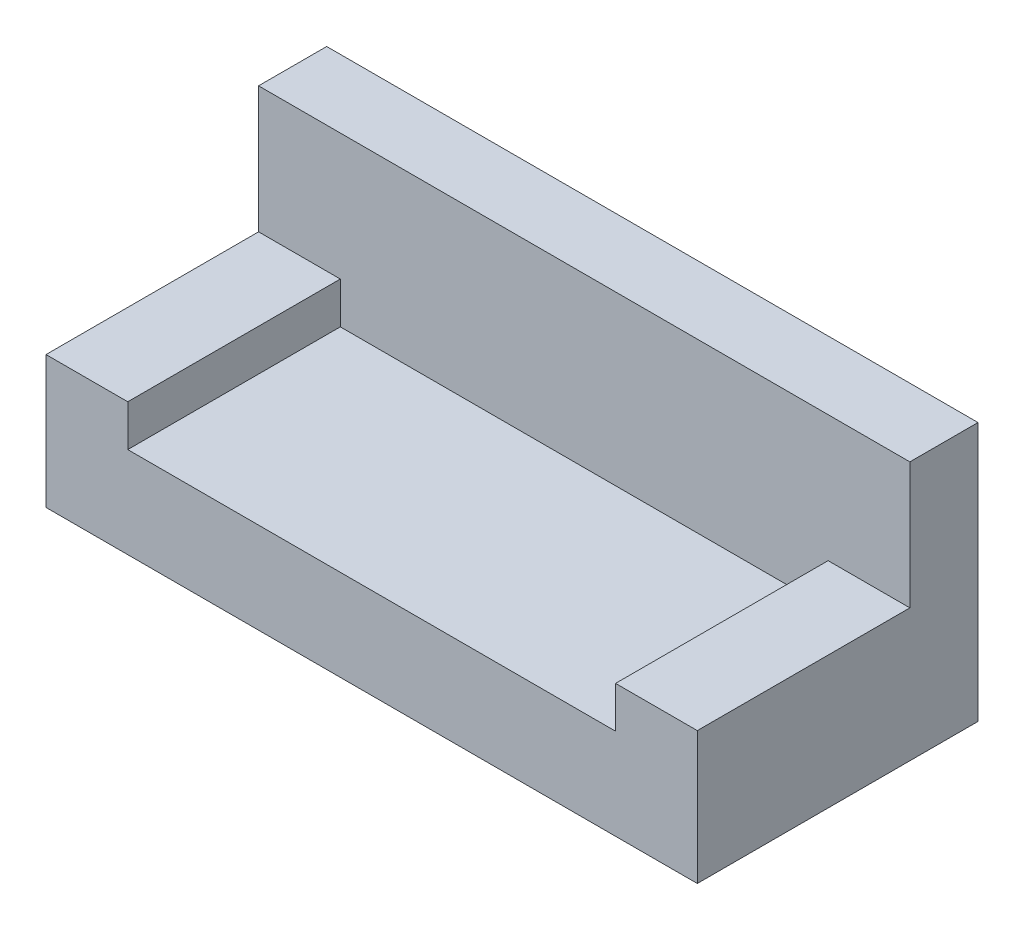
ISO-10303-21;
HEADER;
FILE_DESCRIPTION(('STEP AP214'),'2;1');
FILE_NAME('part.step','',(''),(''),'','','');
FILE_SCHEMA(('AUTOMOTIVE_DESIGN { 1 0 10303 214 1 1 1 1 }'));
ENDSEC;
DATA;
#1=APPLICATION_CONTEXT('core data for automotive mechanical design processes');
#2=APPLICATION_PROTOCOL_DEFINITION('international standard','automotive_design',2000,#1);
#3=PRODUCT_CONTEXT('',#1,'mechanical');
#4=PRODUCT('Part','Part','',(#3));
#5=PRODUCT_RELATED_PRODUCT_CATEGORY('part','',(#4));
#6=PRODUCT_DEFINITION_FORMATION('','',#4);
#7=PRODUCT_DEFINITION_CONTEXT('part definition',#1,'design');
#8=PRODUCT_DEFINITION('design','',#6,#7);
#9=PRODUCT_DEFINITION_SHAPE('','',#8);
#10=(LENGTH_UNIT() NAMED_UNIT(*) SI_UNIT(.MILLI.,.METRE.));
#11=(NAMED_UNIT(*) PLANE_ANGLE_UNIT() SI_UNIT($,.RADIAN.));
#12=(NAMED_UNIT(*) SI_UNIT($,.STERADIAN.) SOLID_ANGLE_UNIT());
#13=UNCERTAINTY_MEASURE_WITH_UNIT(LENGTH_MEASURE(1.E-05),#10,'distance_accuracy_value','');
#14=(GEOMETRIC_REPRESENTATION_CONTEXT(3) GLOBAL_UNCERTAINTY_ASSIGNED_CONTEXT((#13)) GLOBAL_UNIT_ASSIGNED_CONTEXT((#10,
#11,#12)) REPRESENTATION_CONTEXT('',''));
#15=CARTESIAN_POINT('',(0.,0.,0.));
#16=DIRECTION('',(0.,0.,1.));
#17=DIRECTION('',(1.,0.,0.));
#18=AXIS2_PLACEMENT_3D('',#15,#16,#17);
#19=CARTESIAN_POINT('',(0.,950.,0.));
#20=DIRECTION('',(0.,0.,-1.));
#21=DIRECTION('',(-1.,0.,0.));
#22=AXIS2_PLACEMENT_3D('',#19,#20,#21);
#23=PLANE('',#22);
#24=DIRECTION('',(0.,1.,0.));
#25=VECTOR('',#24,1.);
#26=CARTESIAN_POINT('',(300.,334.,0.));
#27=LINE('',#26,#25);
#28=CARTESIAN_POINT('',(300.,334.,0.));
#29=VERTEX_POINT('',#28);
#30=CARTESIAN_POINT('',(300.,486.,0.));
#31=VERTEX_POINT('',#30);
#32=EDGE_CURVE('E126',#29,#31,#27,.T.);
#33=ORIENTED_EDGE('',*,*,#32,.T.);
#34=DIRECTION('',(1.,0.,0.));
#35=VECTOR('',#34,1.);
#36=CARTESIAN_POINT('',(0.,486.,0.));
#37=LINE('',#36,#35);
#38=CARTESIAN_POINT('',(0.,486.,0.));
#39=VERTEX_POINT('',#38);
#40=EDGE_CURVE('E114',#39,#31,#37,.T.);
#41=ORIENTED_EDGE('',*,*,#40,.F.);
#42=DIRECTION('',(0.,-1.,0.));
#43=VECTOR('',#42,1.);
#44=CARTESIAN_POINT('',(0.,950.,0.));
#45=LINE('',#44,#43);
#46=CARTESIAN_POINT('',(0.,0.,0.));
#47=VERTEX_POINT('',#46);
#48=EDGE_CURVE('E11',#39,#47,#45,.T.);
#49=ORIENTED_EDGE('',*,*,#48,.T.);
#50=DIRECTION('',(1.,0.,0.));
#51=VECTOR('',#50,1.);
#52=CARTESIAN_POINT('',(0.,0.,0.));
#53=LINE('',#52,#51);
#54=CARTESIAN_POINT('',(2390.,0.,0.));
#55=VERTEX_POINT('',#54);
#56=EDGE_CURVE('E138',#47,#55,#53,.T.);
#57=ORIENTED_EDGE('',*,*,#56,.T.);
#58=DIRECTION('',(0.,-1.,0.));
#59=VECTOR('',#58,1.);
#60=CARTESIAN_POINT('',(2390.,950.,0.));
#61=LINE('',#60,#59);
#62=CARTESIAN_POINT('',(2390.,486.,0.));
#63=VERTEX_POINT('',#62);
#64=EDGE_CURVE('E44',#63,#55,#61,.T.);
#65=ORIENTED_EDGE('',*,*,#64,.F.);
#66=DIRECTION('',(1.,0.,0.));
#67=VECTOR('',#66,1.);
#68=CARTESIAN_POINT('',(2390.,486.,0.));
#69=LINE('',#68,#67);
#70=CARTESIAN_POINT('',(2090.,486.,0.));
#71=VERTEX_POINT('',#70);
#72=EDGE_CURVE('E199',#71,#63,#69,.T.);
#73=ORIENTED_EDGE('',*,*,#72,.F.);
#74=DIRECTION('',(0.,1.,0.));
#75=VECTOR('',#74,1.);
#76=CARTESIAN_POINT('',(2090.,334.,0.));
#77=LINE('',#76,#75);
#78=CARTESIAN_POINT('',(2090.,334.,0.));
#79=VERTEX_POINT('',#78);
#80=EDGE_CURVE('E178',#79,#71,#77,.T.);
#81=ORIENTED_EDGE('',*,*,#80,.F.);
#82=DIRECTION('',(1.,0.,0.));
#83=VECTOR('',#82,1.);
#84=CARTESIAN_POINT('',(300.,334.,0.));
#85=LINE('',#84,#83);
#86=EDGE_CURVE('E193',#29,#79,#85,.T.);
#87=ORIENTED_EDGE('',*,*,#86,.F.);
#88=EDGE_LOOP('',(#33,#41,#49,#57,#65,#73,#81,#87));
#89=FACE_BOUND('',#88,.T.);
#90=ADVANCED_FACE('F36',(#89),#23,.F.);
#91=CARTESIAN_POINT('',(2090.,334.,0.));
#92=DIRECTION('',(1.,0.,0.));
#93=DIRECTION('',(0.,0.,-1.));
#94=AXIS2_PLACEMENT_3D('',#91,#92,#93);
#95=PLANE('',#94);
#96=DIRECTION('',(0.,0.,1.));
#97=VECTOR('',#96,1.);
#98=CARTESIAN_POINT('',(2090.,486.,0.));
#99=LINE('',#98,#97);
#100=CARTESIAN_POINT('',(2090.,486.,-780.));
#101=VERTEX_POINT('',#100);
#102=EDGE_CURVE('E201',#101,#71,#99,.T.);
#103=ORIENTED_EDGE('',*,*,#102,.F.);
#104=DIRECTION('',(0.,1.,0.));
#105=VECTOR('',#104,1.);
#106=CARTESIAN_POINT('',(2090.,334.,-780.));
#107=LINE('',#106,#105);
#108=CARTESIAN_POINT('',(2090.,334.,-780.));
#109=VERTEX_POINT('',#108);
#110=EDGE_CURVE('E144',#109,#101,#107,.T.);
#111=ORIENTED_EDGE('',*,*,#110,.F.);
#112=DIRECTION('',(0.,0.,-1.));
#113=VECTOR('',#112,1.);
#114=CARTESIAN_POINT('',(2090.,334.,0.));
#115=LINE('',#114,#113);
#116=EDGE_CURVE('E190',#79,#109,#115,.T.);
#117=ORIENTED_EDGE('',*,*,#116,.F.);
#118=ORIENTED_EDGE('',*,*,#80,.T.);
#119=EDGE_LOOP('',(#103,#111,#117,#118));
#120=FACE_BOUND('',#119,.T.);
#121=ADVANCED_FACE('F216',(#120),#95,.F.);
#122=CARTESIAN_POINT('',(0.,950.,0.));
#123=DIRECTION('',(1.,0.,0.));
#124=DIRECTION('',(0.,0.,-1.));
#125=AXIS2_PLACEMENT_3D('',#122,#123,#124);
#126=PLANE('',#125);
#127=DIRECTION('',(0.,0.,1.));
#128=VECTOR('',#127,1.);
#129=CARTESIAN_POINT('',(0.,486.,0.));
#130=LINE('',#129,#128);
#131=CARTESIAN_POINT('',(0.,486.,-780.));
#132=VERTEX_POINT('',#131);
#133=EDGE_CURVE('E111',#132,#39,#130,.T.);
#134=ORIENTED_EDGE('',*,*,#133,.F.);
#135=DIRECTION('',(0.,1.,0.));
#136=VECTOR('',#135,1.);
#137=CARTESIAN_POINT('',(0.,486.,-780.));
#138=LINE('',#137,#136);
#139=CARTESIAN_POINT('',(0.,950.,-780.));
#140=VERTEX_POINT('',#139);
#141=EDGE_CURVE('E187',#132,#140,#138,.T.);
#142=ORIENTED_EDGE('',*,*,#141,.T.);
#143=DIRECTION('',(0.,0.,1.));
#144=VECTOR('',#143,1.);
#145=CARTESIAN_POINT('',(0.,950.,0.));
#146=LINE('',#145,#144);
#147=CARTESIAN_POINT('',(0.,950.,-1030.));
#148=VERTEX_POINT('',#147);
#149=EDGE_CURVE('E153',#148,#140,#146,.T.);
#150=ORIENTED_EDGE('',*,*,#149,.F.);
#151=DIRECTION('',(0.,-1.,0.));
#152=VECTOR('',#151,1.);
#153=CARTESIAN_POINT('',(0.,950.,-1030.));
#154=LINE('',#153,#152);
#155=CARTESIAN_POINT('',(0.,0.,-1030.));
#156=VERTEX_POINT('',#155);
#157=EDGE_CURVE('E135',#148,#156,#154,.T.);
#158=ORIENTED_EDGE('',*,*,#157,.T.);
#159=DIRECTION('',(0.,0.,1.));
#160=VECTOR('',#159,1.);
#161=CARTESIAN_POINT('',(0.,0.,0.));
#162=LINE('',#161,#160);
#163=EDGE_CURVE('E132',#156,#47,#162,.T.);
#164=ORIENTED_EDGE('',*,*,#163,.T.);
#165=ORIENTED_EDGE('',*,*,#48,.F.);
#166=EDGE_LOOP('',(#134,#142,#150,#158,#164,#165));
#167=FACE_BOUND('',#166,.T.);
#168=ADVANCED_FACE('F38',(#167),#126,.F.);
#169=CARTESIAN_POINT('',(2390.,950.,0.));
#170=DIRECTION('',(-1.,0.,0.));
#171=DIRECTION('',(0.,0.,1.));
#172=AXIS2_PLACEMENT_3D('',#169,#170,#171);
#173=PLANE('',#172);
#174=DIRECTION('',(0.,0.,-1.));
#175=VECTOR('',#174,1.);
#176=CARTESIAN_POINT('',(2390.,950.,0.));
#177=LINE('',#176,#175);
#178=CARTESIAN_POINT('',(2390.,950.,-780.));
#179=VERTEX_POINT('',#178);
#180=CARTESIAN_POINT('',(2390.,950.,-1030.));
#181=VERTEX_POINT('',#180);
#182=EDGE_CURVE('E171',#179,#181,#177,.T.);
#183=ORIENTED_EDGE('',*,*,#182,.F.);
#184=DIRECTION('',(0.,1.,0.));
#185=VECTOR('',#184,1.);
#186=CARTESIAN_POINT('',(2390.,486.,-780.));
#187=LINE('',#186,#185);
#188=CARTESIAN_POINT('',(2390.,486.,-780.));
#189=VERTEX_POINT('',#188);
#190=EDGE_CURVE('E119',#189,#179,#187,.T.);
#191=ORIENTED_EDGE('',*,*,#190,.F.);
#192=DIRECTION('',(0.,0.,-1.));
#193=VECTOR('',#192,1.);
#194=CARTESIAN_POINT('',(2390.,486.,0.));
#195=LINE('',#194,#193);
#196=EDGE_CURVE('E165',#63,#189,#195,.T.);
#197=ORIENTED_EDGE('',*,*,#196,.F.);
#198=ORIENTED_EDGE('',*,*,#64,.T.);
#199=DIRECTION('',(0.,0.,-1.));
#200=VECTOR('',#199,1.);
#201=CARTESIAN_POINT('',(2390.,0.,0.));
#202=LINE('',#201,#200);
#203=CARTESIAN_POINT('',(2390.,0.,-1030.));
#204=VERTEX_POINT('',#203);
#205=EDGE_CURVE('E141',#55,#204,#202,.T.);
#206=ORIENTED_EDGE('',*,*,#205,.T.);
#207=DIRECTION('',(0.,-1.,0.));
#208=VECTOR('',#207,1.);
#209=CARTESIAN_POINT('',(2390.,950.,-1030.));
#210=LINE('',#209,#208);
#211=EDGE_CURVE('E155',#181,#204,#210,.T.);
#212=ORIENTED_EDGE('',*,*,#211,.F.);
#213=EDGE_LOOP('',(#183,#191,#197,#198,#206,#212));
#214=FACE_BOUND('',#213,.T.);
#215=ADVANCED_FACE('F161',(#214),#173,.F.);
#216=CARTESIAN_POINT('',(0.,950.,-1030.));
#217=DIRECTION('',(0.,0.,1.));
#218=DIRECTION('',(1.,0.,0.));
#219=AXIS2_PLACEMENT_3D('',#216,#217,#218);
#220=PLANE('',#219);
#221=DIRECTION('',(-1.,0.,0.));
#222=VECTOR('',#221,1.);
#223=CARTESIAN_POINT('',(0.,0.,-1030.));
#224=LINE('',#223,#222);
#225=EDGE_CURVE('E151',#204,#156,#224,.T.);
#226=ORIENTED_EDGE('',*,*,#225,.T.);
#227=ORIENTED_EDGE('',*,*,#157,.F.);
#228=DIRECTION('',(-1.,0.,0.));
#229=VECTOR('',#228,1.);
#230=CARTESIAN_POINT('',(0.,950.,-1030.));
#231=LINE('',#230,#229);
#232=EDGE_CURVE('E147',#181,#148,#231,.T.);
#233=ORIENTED_EDGE('',*,*,#232,.F.);
#234=ORIENTED_EDGE('',*,*,#211,.T.);
#235=EDGE_LOOP('',(#226,#227,#233,#234));
#236=FACE_BOUND('',#235,.T.);
#237=ADVANCED_FACE('F169',(#236),#220,.F.);
#238=CARTESIAN_POINT('',(0.,950.,0.));
#239=DIRECTION('',(0.,-1.,0.));
#240=DIRECTION('',(0.,0.,-1.));
#241=AXIS2_PLACEMENT_3D('',#238,#239,#240);
#242=PLANE('',#241);
#243=ORIENTED_EDGE('',*,*,#149,.T.);
#244=DIRECTION('',(-1.,0.,0.));
#245=VECTOR('',#244,1.);
#246=CARTESIAN_POINT('',(300.,950.,-780.));
#247=LINE('',#246,#245);
#248=EDGE_CURVE('E184',#179,#140,#247,.T.);
#249=ORIENTED_EDGE('',*,*,#248,.F.);
#250=ORIENTED_EDGE('',*,*,#182,.T.);
#251=ORIENTED_EDGE('',*,*,#232,.T.);
#252=EDGE_LOOP('',(#243,#249,#250,#251));
#253=FACE_BOUND('',#252,.T.);
#254=ADVANCED_FACE('F236',(#253),#242,.F.);
#255=CARTESIAN_POINT('',(0.,0.,0.));
#256=DIRECTION('',(0.,-1.,0.));
#257=DIRECTION('',(0.,0.,-1.));
#258=AXIS2_PLACEMENT_3D('',#255,#256,#257);
#259=PLANE('',#258);
#260=ORIENTED_EDGE('',*,*,#163,.F.);
#261=ORIENTED_EDGE('',*,*,#225,.F.);
#262=ORIENTED_EDGE('',*,*,#205,.F.);
#263=ORIENTED_EDGE('',*,*,#56,.F.);
#264=EDGE_LOOP('',(#260,#261,#262,#263));
#265=FACE_BOUND('',#264,.T.);
#266=ADVANCED_FACE('F167',(#265),#259,.T.);
#267=CARTESIAN_POINT('',(300.,334.,0.));
#268=DIRECTION('',(-1.,0.,0.));
#269=DIRECTION('',(0.,0.,1.));
#270=AXIS2_PLACEMENT_3D('',#267,#268,#269);
#271=PLANE('',#270);
#272=DIRECTION('',(0.,1.,0.));
#273=VECTOR('',#272,1.);
#274=CARTESIAN_POINT('',(300.,334.,-780.));
#275=LINE('',#274,#273);
#276=CARTESIAN_POINT('',(300.,334.,-780.));
#277=VERTEX_POINT('',#276);
#278=CARTESIAN_POINT('',(300.,486.,-780.));
#279=VERTEX_POINT('',#278);
#280=EDGE_CURVE('E139',#277,#279,#275,.T.);
#281=ORIENTED_EDGE('',*,*,#280,.T.);
#282=DIRECTION('',(0.,0.,-1.));
#283=VECTOR('',#282,1.);
#284=CARTESIAN_POINT('',(300.,486.,0.));
#285=LINE('',#284,#283);
#286=EDGE_CURVE('E127',#31,#279,#285,.T.);
#287=ORIENTED_EDGE('',*,*,#286,.F.);
#288=ORIENTED_EDGE('',*,*,#32,.F.);
#289=DIRECTION('',(0.,0.,1.));
#290=VECTOR('',#289,1.);
#291=CARTESIAN_POINT('',(300.,334.,0.));
#292=LINE('',#291,#290);
#293=EDGE_CURVE('E186',#277,#29,#292,.T.);
#294=ORIENTED_EDGE('',*,*,#293,.F.);
#295=EDGE_LOOP('',(#281,#287,#288,#294));
#296=FACE_BOUND('',#295,.T.);
#297=ADVANCED_FACE('F209',(#296),#271,.F.);
#298=CARTESIAN_POINT('',(300.,334.,-780.));
#299=DIRECTION('',(0.,0.,-1.));
#300=DIRECTION('',(-1.,0.,0.));
#301=AXIS2_PLACEMENT_3D('',#298,#299,#300);
#302=PLANE('',#301);
#303=ORIENTED_EDGE('',*,*,#248,.T.);
#304=ORIENTED_EDGE('',*,*,#141,.F.);
#305=DIRECTION('',(-1.,0.,0.));
#306=VECTOR('',#305,1.);
#307=CARTESIAN_POINT('',(0.,486.,-780.));
#308=LINE('',#307,#306);
#309=EDGE_CURVE('E51',#279,#132,#308,.T.);
#310=ORIENTED_EDGE('',*,*,#309,.F.);
#311=ORIENTED_EDGE('',*,*,#280,.F.);
#312=DIRECTION('',(-1.,0.,0.));
#313=VECTOR('',#312,1.);
#314=CARTESIAN_POINT('',(300.,334.,-780.));
#315=LINE('',#314,#313);
#316=EDGE_CURVE('E179',#109,#277,#315,.T.);
#317=ORIENTED_EDGE('',*,*,#316,.F.);
#318=ORIENTED_EDGE('',*,*,#110,.T.);
#319=DIRECTION('',(-1.,0.,0.));
#320=VECTOR('',#319,1.);
#321=CARTESIAN_POINT('',(2390.,486.,-780.));
#322=LINE('',#321,#320);
#323=EDGE_CURVE('E59',#189,#101,#322,.T.);
#324=ORIENTED_EDGE('',*,*,#323,.F.);
#325=ORIENTED_EDGE('',*,*,#190,.T.);
#326=EDGE_LOOP('',(#303,#304,#310,#311,#317,#318,#324,#325));
#327=FACE_BOUND('',#326,.T.);
#328=ADVANCED_FACE('F211',(#327),#302,.F.);
#329=CARTESIAN_POINT('',(0.,334.,0.));
#330=DIRECTION('',(0.,-1.,0.));
#331=DIRECTION('',(0.,0.,-1.));
#332=AXIS2_PLACEMENT_3D('',#329,#330,#331);
#333=PLANE('',#332);
#334=ORIENTED_EDGE('',*,*,#293,.T.);
#335=ORIENTED_EDGE('',*,*,#86,.T.);
#336=ORIENTED_EDGE('',*,*,#116,.T.);
#337=ORIENTED_EDGE('',*,*,#316,.T.);
#338=EDGE_LOOP('',(#334,#335,#336,#337));
#339=FACE_BOUND('',#338,.T.);
#340=ADVANCED_FACE('F213',(#339),#333,.F.);
#341=CARTESIAN_POINT('',(0.,486.,0.));
#342=DIRECTION('',(0.,1.,0.));
#343=DIRECTION('',(0.,0.,1.));
#344=AXIS2_PLACEMENT_3D('',#341,#342,#343);
#345=PLANE('',#344);
#346=ORIENTED_EDGE('',*,*,#196,.T.);
#347=ORIENTED_EDGE('',*,*,#323,.T.);
#348=ORIENTED_EDGE('',*,*,#102,.T.);
#349=ORIENTED_EDGE('',*,*,#72,.T.);
#350=EDGE_LOOP('',(#346,#347,#348,#349));
#351=FACE_BOUND('',#350,.T.);
#352=ADVANCED_FACE('F217',(#351),#345,.T.);
#353=CARTESIAN_POINT('',(0.,486.,0.));
#354=DIRECTION('',(0.,-1.,0.));
#355=DIRECTION('',(0.,0.,-1.));
#356=AXIS2_PLACEMENT_3D('',#353,#354,#355);
#357=PLANE('',#356);
#358=ORIENTED_EDGE('',*,*,#133,.T.);
#359=ORIENTED_EDGE('',*,*,#40,.T.);
#360=ORIENTED_EDGE('',*,*,#286,.T.);
#361=ORIENTED_EDGE('',*,*,#309,.T.);
#362=EDGE_LOOP('',(#358,#359,#360,#361));
#363=FACE_BOUND('',#362,.T.);
#364=ADVANCED_FACE('F113',(#363),#357,.F.);
#365=CLOSED_SHELL('',(#90,#121,#168,#215,#237,#254,#266,#297,#328,#340,#352,#364));
#366=MANIFOLD_SOLID_BREP('B2',#365);
#367=ADVANCED_BREP_SHAPE_REPRESENTATION('',(#18,#366),#14);
#368=SHAPE_DEFINITION_REPRESENTATION(#9,#367);
ENDSEC;
END-ISO-10303-21;
